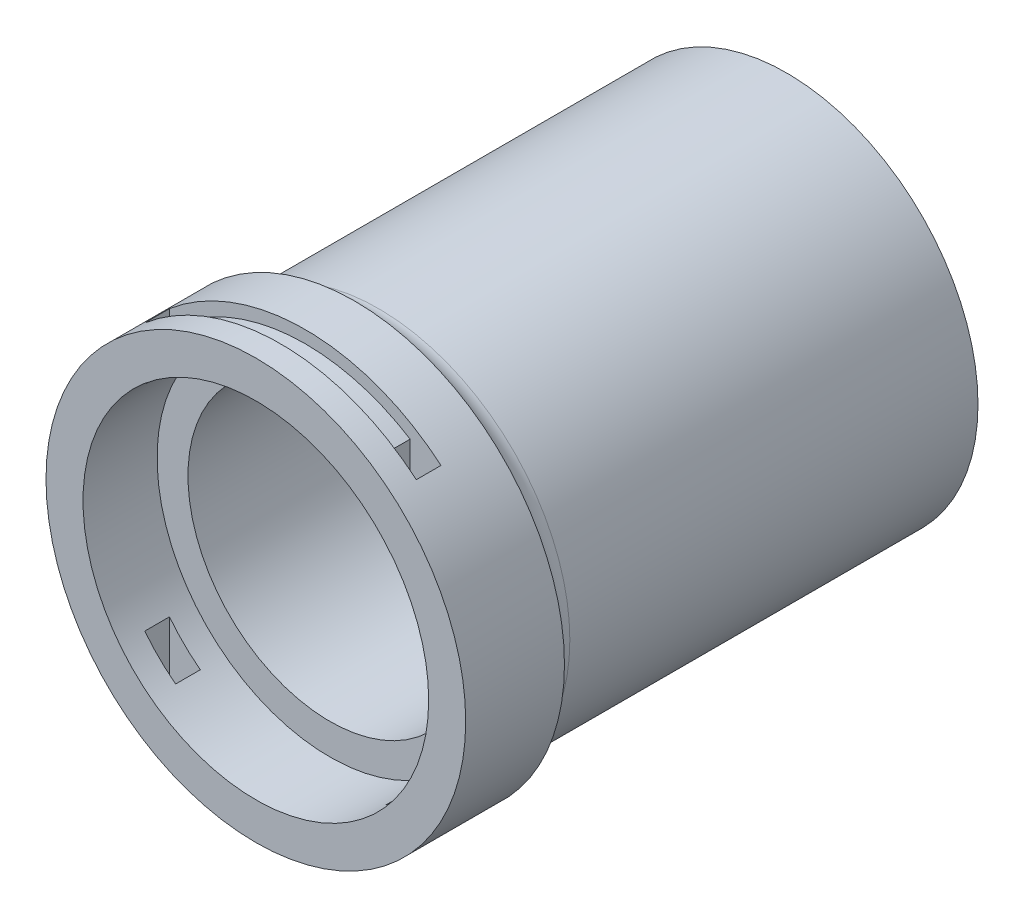
ISO-10303-21;
HEADER;
FILE_DESCRIPTION(('STEP AP214'),'2;1');
FILE_NAME('part.step','',(''),(''),'','','');
FILE_SCHEMA(('AUTOMOTIVE_DESIGN { 1 0 10303 214 1 1 1 1 }'));
ENDSEC;
DATA;
#1=APPLICATION_CONTEXT('core data for automotive mechanical design processes');
#2=APPLICATION_PROTOCOL_DEFINITION('international standard','automotive_design',2000,#1);
#3=PRODUCT_CONTEXT('',#1,'mechanical');
#4=PRODUCT('Part','Part','',(#3));
#5=PRODUCT_RELATED_PRODUCT_CATEGORY('part','',(#4));
#6=PRODUCT_DEFINITION_FORMATION('','',#4);
#7=PRODUCT_DEFINITION_CONTEXT('part definition',#1,'design');
#8=PRODUCT_DEFINITION('design','',#6,#7);
#9=PRODUCT_DEFINITION_SHAPE('','',#8);
#10=(LENGTH_UNIT() NAMED_UNIT(*) SI_UNIT(.MILLI.,.METRE.));
#11=(NAMED_UNIT(*) PLANE_ANGLE_UNIT() SI_UNIT($,.RADIAN.));
#12=(NAMED_UNIT(*) SI_UNIT($,.STERADIAN.) SOLID_ANGLE_UNIT());
#13=UNCERTAINTY_MEASURE_WITH_UNIT(LENGTH_MEASURE(1.E-05),#10,'distance_accuracy_value','');
#14=(GEOMETRIC_REPRESENTATION_CONTEXT(3) GLOBAL_UNCERTAINTY_ASSIGNED_CONTEXT((#13)) GLOBAL_UNIT_ASSIGNED_CONTEXT((#10,
#11,#12)) REPRESENTATION_CONTEXT('',''));
#15=CARTESIAN_POINT('',(0.,0.,0.));
#16=DIRECTION('',(0.,0.,1.));
#17=DIRECTION('',(1.,0.,0.));
#18=AXIS2_PLACEMENT_3D('',#15,#16,#17);
#19=CARTESIAN_POINT('',(0.,0.,-17.));
#20=DIRECTION('',(0.,0.,1.));
#21=DIRECTION('',(1.,0.,0.));
#22=AXIS2_PLACEMENT_3D('',#19,#20,#21);
#23=CYLINDRICAL_SURFACE('',#22,5.625);
#24=CARTESIAN_POINT('',(0.,0.,5.99999999999999));
#25=DIRECTION('',(0.,0.,1.));
#26=DIRECTION('',(1.,0.,0.));
#27=AXIS2_PLACEMENT_3D('',#24,#25,#26);
#28=CIRCLE('',#27,5.625);
#29=CARTESIAN_POINT('',(5.625,0.,5.99999999999999));
#30=VERTEX_POINT('',#29);
#31=EDGE_CURVE('E247',#30,#30,#28,.F.);
#32=ORIENTED_EDGE('',*,*,#31,.F.);
#33=EDGE_LOOP('',(#32));
#34=FACE_BOUND('',#33,.T.);
#35=CARTESIAN_POINT('',(0.,0.,-0.999999999999997));
#36=DIRECTION('',(0.,0.,-1.));
#37=DIRECTION('',(-1.,0.,0.));
#38=AXIS2_PLACEMENT_3D('',#35,#36,#37);
#39=CIRCLE('',#38,5.625);
#40=CARTESIAN_POINT('',(-5.625,0.,-0.999999999999997));
#41=VERTEX_POINT('',#40);
#42=EDGE_CURVE('E37',#41,#41,#39,.F.);
#43=ORIENTED_EDGE('',*,*,#42,.F.);
#44=EDGE_LOOP('',(#43));
#45=FACE_BOUND('',#44,.T.);
#46=ADVANCED_FACE('F33',(#34,#45),#23,.F.);
#47=CARTESIAN_POINT('',(-8.5,-20.,0.));
#48=DIRECTION('',(1.,0.,0.));
#49=DIRECTION('',(0.,0.,-1.));
#50=AXIS2_PLACEMENT_3D('',#47,#48,#49);
#51=PLANE('',#50);
#52=DIRECTION('',(0.,0.,1.));
#53=VECTOR('',#52,1.);
#54=CARTESIAN_POINT('',(-8.5,13.555441711726,22.));
#55=LINE('',#54,#53);
#56=CARTESIAN_POINT('',(-8.5,13.555441711726,22.));
#57=VERTEX_POINT('',#56);
#58=CARTESIAN_POINT('',(-8.5,13.555441711726,24.));
#59=VERTEX_POINT('',#58);
#60=EDGE_CURVE('E151',#57,#59,#55,.T.);
#61=ORIENTED_EDGE('',*,*,#60,.F.);
#62=DIRECTION('',(0.,1.,0.));
#63=VECTOR('',#62,1.);
#64=CARTESIAN_POINT('',(-8.5,-20.,22.));
#65=LINE('',#64,#63);
#66=CARTESIAN_POINT('',(-8.5,11.1242977306435,22.));
#67=VERTEX_POINT('',#66);
#68=EDGE_CURVE('E194',#67,#57,#65,.T.);
#69=ORIENTED_EDGE('',*,*,#68,.F.);
#70=DIRECTION('',(0.,0.,1.));
#71=VECTOR('',#70,1.);
#72=CARTESIAN_POINT('',(-8.5,11.1242977306435,20.));
#73=LINE('',#72,#71);
#74=CARTESIAN_POINT('',(-8.5,11.1242977306435,24.));
#75=VERTEX_POINT('',#74);
#76=EDGE_CURVE('E278',#75,#67,#73,.F.);
#77=ORIENTED_EDGE('',*,*,#76,.F.);
#78=DIRECTION('',(0.,1.,0.));
#79=VECTOR('',#78,1.);
#80=CARTESIAN_POINT('',(-8.5,-20.,24.));
#81=LINE('',#80,#79);
#82=EDGE_CURVE('E184',#75,#59,#81,.T.);
#83=ORIENTED_EDGE('',*,*,#82,.T.);
#84=EDGE_LOOP('',(#61,#69,#77,#83));
#85=FACE_BOUND('',#84,.T.);
#86=ADVANCED_FACE('F343',(#85),#51,.F.);
#87=CARTESIAN_POINT('',(8.5,-20.,0.));
#88=DIRECTION('',(1.,0.,0.));
#89=DIRECTION('',(0.,0.,-1.));
#90=AXIS2_PLACEMENT_3D('',#87,#88,#89);
#91=PLANE('',#90);
#92=DIRECTION('',(0.,1.,0.));
#93=VECTOR('',#92,1.);
#94=CARTESIAN_POINT('',(8.5,-20.,22.));
#95=LINE('',#94,#93);
#96=CARTESIAN_POINT('',(8.5,11.1242977306435,22.));
#97=VERTEX_POINT('',#96);
#98=CARTESIAN_POINT('',(8.5,13.555441711726,22.));
#99=VERTEX_POINT('',#98);
#100=EDGE_CURVE('E165',#97,#99,#95,.T.);
#101=ORIENTED_EDGE('',*,*,#100,.T.);
#102=DIRECTION('',(0.,0.,1.));
#103=VECTOR('',#102,1.);
#104=CARTESIAN_POINT('',(8.5,13.555441711726,22.));
#105=LINE('',#104,#103);
#106=CARTESIAN_POINT('',(8.5,13.555441711726,24.));
#107=VERTEX_POINT('',#106);
#108=EDGE_CURVE('E11',#99,#107,#105,.T.);
#109=ORIENTED_EDGE('',*,*,#108,.T.);
#110=DIRECTION('',(0.,1.,0.));
#111=VECTOR('',#110,1.);
#112=CARTESIAN_POINT('',(8.5,-20.,24.));
#113=LINE('',#112,#111);
#114=CARTESIAN_POINT('',(8.5,11.1242977306435,24.));
#115=VERTEX_POINT('',#114);
#116=EDGE_CURVE('E162',#115,#107,#113,.T.);
#117=ORIENTED_EDGE('',*,*,#116,.F.);
#118=DIRECTION('',(0.,0.,1.));
#119=VECTOR('',#118,1.);
#120=CARTESIAN_POINT('',(8.5,11.1242977306435,20.));
#121=LINE('',#120,#119);
#122=EDGE_CURVE('E293',#115,#97,#121,.F.);
#123=ORIENTED_EDGE('',*,*,#122,.T.);
#124=EDGE_LOOP('',(#101,#109,#117,#123));
#125=FACE_BOUND('',#124,.T.);
#126=ADVANCED_FACE('F161',(#125),#91,.T.);
#127=CARTESIAN_POINT('',(0.,0.,18.));
#128=DIRECTION('',(0.,0.,1.));
#129=DIRECTION('',(1.,0.,0.));
#130=AXIS2_PLACEMENT_3D('',#127,#128,#129);
#131=CYLINDRICAL_SURFACE('',#130,17.);
#132=CARTESIAN_POINT('',(0.,0.,22.));
#133=DIRECTION('',(0.,0.,1.));
#134=DIRECTION('',(1.,0.,0.));
#135=AXIS2_PLACEMENT_3D('',#132,#133,#134);
#136=CIRCLE('',#135,17.);
#137=CARTESIAN_POINT('',(-11.,12.9614813968157,22.));
#138=VERTEX_POINT('',#137);
#139=CARTESIAN_POINT('',(11.,12.9614813968157,22.));
#140=VERTEX_POINT('',#139);
#141=EDGE_CURVE('E199',#138,#140,#136,.F.);
#142=ORIENTED_EDGE('',*,*,#141,.T.);
#143=DIRECTION('',(0.,0.,1.));
#144=VECTOR('',#143,1.);
#145=CARTESIAN_POINT('',(11.,12.9614813968157,18.));
#146=LINE('',#145,#144);
#147=CARTESIAN_POINT('',(11.,12.9614813968157,24.));
#148=VERTEX_POINT('',#147);
#149=EDGE_CURVE('E178',#140,#148,#146,.T.);
#150=ORIENTED_EDGE('',*,*,#149,.T.);
#151=CARTESIAN_POINT('',(0.,0.,24.));
#152=DIRECTION('',(0.,0.,1.));
#153=DIRECTION('',(1.,0.,0.));
#154=AXIS2_PLACEMENT_3D('',#151,#152,#153);
#155=CIRCLE('',#154,17.);
#156=CARTESIAN_POINT('',(-11.,12.9614813968157,24.));
#157=VERTEX_POINT('',#156);
#158=EDGE_CURVE('E207',#157,#148,#155,.F.);
#159=ORIENTED_EDGE('',*,*,#158,.F.);
#160=DIRECTION('',(0.,0.,1.));
#161=VECTOR('',#160,1.);
#162=CARTESIAN_POINT('',(-11.,12.9614813968157,18.));
#163=LINE('',#162,#161);
#164=EDGE_CURVE('E202',#138,#157,#163,.T.);
#165=ORIENTED_EDGE('',*,*,#164,.F.);
#166=EDGE_LOOP('',(#142,#150,#159,#165));
#167=FACE_BOUND('',#166,.T.);
#168=CARTESIAN_POINT('',(0.,0.,26.));
#169=DIRECTION('',(0.,0.,1.));
#170=DIRECTION('',(1.,0.,0.));
#171=AXIS2_PLACEMENT_3D('',#168,#169,#170);
#172=CIRCLE('',#171,17.);
#173=CARTESIAN_POINT('',(17.,0.,26.));
#174=VERTEX_POINT('',#173);
#175=EDGE_CURVE('E232',#174,#174,#172,.T.);
#176=ORIENTED_EDGE('',*,*,#175,.F.);
#177=EDGE_LOOP('',(#176));
#178=FACE_BOUND('',#177,.T.);
#179=CARTESIAN_POINT('',(0.,0.,18.));
#180=DIRECTION('',(0.,0.,1.));
#181=DIRECTION('',(1.,0.,0.));
#182=AXIS2_PLACEMENT_3D('',#179,#180,#181);
#183=CIRCLE('',#182,17.);
#184=CARTESIAN_POINT('',(17.,0.,18.));
#185=VERTEX_POINT('',#184);
#186=EDGE_CURVE('E235',#185,#185,#183,.T.);
#187=ORIENTED_EDGE('',*,*,#186,.T.);
#188=EDGE_LOOP('',(#187));
#189=FACE_BOUND('',#188,.T.);
#190=DIRECTION('',(0.,0.,1.));
#191=VECTOR('',#190,1.);
#192=CARTESIAN_POINT('',(11.,-12.9614813968157,18.));
#193=LINE('',#192,#191);
#194=CARTESIAN_POINT('',(11.,-12.9614813968157,24.));
#195=VERTEX_POINT('',#194);
#196=CARTESIAN_POINT('',(11.,-12.9614813968157,22.));
#197=VERTEX_POINT('',#196);
#198=EDGE_CURVE('E181',#195,#197,#193,.F.);
#199=ORIENTED_EDGE('',*,*,#198,.T.);
#200=CARTESIAN_POINT('',(-11.,-12.9614813968157,22.));
#201=VERTEX_POINT('',#200);
#202=EDGE_CURVE('E201',#197,#201,#136,.F.);
#203=ORIENTED_EDGE('',*,*,#202,.T.);
#204=DIRECTION('',(0.,0.,1.));
#205=VECTOR('',#204,1.);
#206=CARTESIAN_POINT('',(-11.,-12.9614813968157,18.));
#207=LINE('',#206,#205);
#208=CARTESIAN_POINT('',(-11.,-12.9614813968157,24.));
#209=VERTEX_POINT('',#208);
#210=EDGE_CURVE('E204',#209,#201,#207,.F.);
#211=ORIENTED_EDGE('',*,*,#210,.F.);
#212=EDGE_CURVE('E57',#195,#209,#155,.F.);
#213=ORIENTED_EDGE('',*,*,#212,.F.);
#214=EDGE_LOOP('',(#199,#203,#211,#213));
#215=FACE_BOUND('',#214,.T.);
#216=ADVANCED_FACE('F417',(#167,#178,#189,#215),#131,.T.);
#217=DIRECTION('',(0.,0.,1.));
#218=VECTOR('',#217,1.);
#219=CARTESIAN_POINT('',(-8.5,-13.555441711726,22.));
#220=LINE('',#219,#218);
#221=CARTESIAN_POINT('',(-8.5,-13.555441711726,24.));
#222=VERTEX_POINT('',#221);
#223=CARTESIAN_POINT('',(-8.5,-13.555441711726,22.));
#224=VERTEX_POINT('',#223);
#225=EDGE_CURVE('E170',#222,#224,#220,.F.);
#226=ORIENTED_EDGE('',*,*,#225,.F.);
#227=CARTESIAN_POINT('',(-8.5,-11.1242977306435,24.));
#228=VERTEX_POINT('',#227);
#229=EDGE_CURVE('E197',#222,#228,#81,.T.);
#230=ORIENTED_EDGE('',*,*,#229,.T.);
#231=DIRECTION('',(0.,0.,1.));
#232=VECTOR('',#231,1.);
#233=CARTESIAN_POINT('',(-8.5,-11.1242977306435,20.));
#234=LINE('',#233,#232);
#235=CARTESIAN_POINT('',(-8.5,-11.1242977306435,22.));
#236=VERTEX_POINT('',#235);
#237=EDGE_CURVE('E256',#236,#228,#234,.T.);
#238=ORIENTED_EDGE('',*,*,#237,.F.);
#239=EDGE_CURVE('E193',#224,#236,#65,.T.);
#240=ORIENTED_EDGE('',*,*,#239,.F.);
#241=EDGE_LOOP('',(#226,#230,#238,#240));
#242=FACE_BOUND('',#241,.T.);
#243=ADVANCED_FACE('F351',(#242),#51,.F.);
#244=CARTESIAN_POINT('',(8.5,-13.555441711726,24.));
#245=VERTEX_POINT('',#244);
#246=CARTESIAN_POINT('',(8.5,-11.1242977306435,24.));
#247=VERTEX_POINT('',#246);
#248=EDGE_CURVE('E169',#245,#247,#113,.T.);
#249=ORIENTED_EDGE('',*,*,#248,.F.);
#250=DIRECTION('',(0.,0.,1.));
#251=VECTOR('',#250,1.);
#252=CARTESIAN_POINT('',(8.5,-13.555441711726,22.));
#253=LINE('',#252,#251);
#254=CARTESIAN_POINT('',(8.5,-13.555441711726,22.));
#255=VERTEX_POINT('',#254);
#256=EDGE_CURVE('E173',#245,#255,#253,.F.);
#257=ORIENTED_EDGE('',*,*,#256,.T.);
#258=CARTESIAN_POINT('',(8.5,-11.1242977306435,22.));
#259=VERTEX_POINT('',#258);
#260=EDGE_CURVE('E182',#255,#259,#95,.T.);
#261=ORIENTED_EDGE('',*,*,#260,.T.);
#262=DIRECTION('',(0.,0.,1.));
#263=VECTOR('',#262,1.);
#264=CARTESIAN_POINT('',(8.5,-11.1242977306435,20.));
#265=LINE('',#264,#263);
#266=EDGE_CURVE('E42',#259,#247,#265,.T.);
#267=ORIENTED_EDGE('',*,*,#266,.T.);
#268=EDGE_LOOP('',(#249,#257,#261,#267));
#269=FACE_BOUND('',#268,.T.);
#270=ADVANCED_FACE('F415',(#269),#91,.T.);
#271=CARTESIAN_POINT('',(0.,0.,20.));
#272=DIRECTION('',(0.,0.,1.));
#273=DIRECTION('',(1.,0.,0.));
#274=AXIS2_PLACEMENT_3D('',#271,#272,#273);
#275=CYLINDRICAL_SURFACE('',#274,14.);
#276=ORIENTED_EDGE('',*,*,#122,.F.);
#277=CARTESIAN_POINT('',(0.,0.,24.));
#278=DIRECTION('',(0.,0.,-1.));
#279=DIRECTION('',(-1.,0.,0.));
#280=AXIS2_PLACEMENT_3D('',#277,#278,#279);
#281=CIRCLE('',#280,14.);
#282=CARTESIAN_POINT('',(11.,8.66025403784439,24.));
#283=VERTEX_POINT('',#282);
#284=EDGE_CURVE('E168',#283,#115,#281,.F.);
#285=ORIENTED_EDGE('',*,*,#284,.F.);
#286=DIRECTION('',(0.,0.,1.));
#287=VECTOR('',#286,1.);
#288=CARTESIAN_POINT('',(11.,8.66025403784439,20.));
#289=LINE('',#288,#287);
#290=CARTESIAN_POINT('',(11.,8.66025403784439,22.));
#291=VERTEX_POINT('',#290);
#292=EDGE_CURVE('E286',#291,#283,#289,.T.);
#293=ORIENTED_EDGE('',*,*,#292,.F.);
#294=CARTESIAN_POINT('',(0.,0.,22.));
#295=DIRECTION('',(0.,0.,-1.));
#296=DIRECTION('',(-1.,0.,0.));
#297=AXIS2_PLACEMENT_3D('',#294,#295,#296);
#298=CIRCLE('',#297,14.);
#299=EDGE_CURVE('E290',#291,#97,#298,.F.);
#300=ORIENTED_EDGE('',*,*,#299,.T.);
#301=EDGE_LOOP('',(#276,#285,#293,#300));
#302=FACE_BOUND('',#301,.T.);
#303=DIRECTION('',(0.,0.,1.));
#304=VECTOR('',#303,1.);
#305=CARTESIAN_POINT('',(-11.,8.66025403784438,20.));
#306=LINE('',#305,#304);
#307=CARTESIAN_POINT('',(-11.,8.66025403784438,22.));
#308=VERTEX_POINT('',#307);
#309=CARTESIAN_POINT('',(-11.,8.66025403784438,24.));
#310=VERTEX_POINT('',#309);
#311=EDGE_CURVE('E282',#308,#310,#306,.T.);
#312=ORIENTED_EDGE('',*,*,#311,.T.);
#313=CARTESIAN_POINT('',(0.,0.,24.));
#314=DIRECTION('',(0.,0.,1.));
#315=DIRECTION('',(1.,0.,0.));
#316=AXIS2_PLACEMENT_3D('',#313,#314,#315);
#317=CIRCLE('',#316,14.);
#318=EDGE_CURVE('E279',#310,#75,#317,.F.);
#319=ORIENTED_EDGE('',*,*,#318,.T.);
#320=ORIENTED_EDGE('',*,*,#76,.T.);
#321=CARTESIAN_POINT('',(0.,0.,22.));
#322=DIRECTION('',(0.,0.,1.));
#323=DIRECTION('',(1.,0.,0.));
#324=AXIS2_PLACEMENT_3D('',#321,#322,#323);
#325=CIRCLE('',#324,14.);
#326=EDGE_CURVE('E272',#308,#67,#325,.F.);
#327=ORIENTED_EDGE('',*,*,#326,.F.);
#328=EDGE_LOOP('',(#312,#319,#320,#327));
#329=FACE_BOUND('',#328,.T.);
#330=ORIENTED_EDGE('',*,*,#237,.T.);
#331=CARTESIAN_POINT('',(-11.,-8.66025403784438,24.));
#332=VERTEX_POINT('',#331);
#333=EDGE_CURVE('E275',#228,#332,#317,.F.);
#334=ORIENTED_EDGE('',*,*,#333,.T.);
#335=DIRECTION('',(0.,0.,1.));
#336=VECTOR('',#335,1.);
#337=CARTESIAN_POINT('',(-11.,-8.66025403784438,20.));
#338=LINE('',#337,#336);
#339=CARTESIAN_POINT('',(-11.,-8.66025403784438,22.));
#340=VERTEX_POINT('',#339);
#341=EDGE_CURVE('E271',#332,#340,#338,.F.);
#342=ORIENTED_EDGE('',*,*,#341,.T.);
#343=EDGE_CURVE('E269',#236,#340,#325,.F.);
#344=ORIENTED_EDGE('',*,*,#343,.F.);
#345=EDGE_LOOP('',(#330,#334,#342,#344));
#346=FACE_BOUND('',#345,.T.);
#347=CARTESIAN_POINT('',(0.,0.,20.));
#348=DIRECTION('',(0.,0.,1.));
#349=DIRECTION('',(1.,0.,0.));
#350=AXIS2_PLACEMENT_3D('',#347,#348,#349);
#351=CIRCLE('',#350,14.);
#352=CARTESIAN_POINT('',(14.,0.,20.));
#353=VERTEX_POINT('',#352);
#354=EDGE_CURVE('E225',#353,#353,#351,.T.);
#355=ORIENTED_EDGE('',*,*,#354,.F.);
#356=EDGE_LOOP('',(#355));
#357=FACE_BOUND('',#356,.T.);
#358=CARTESIAN_POINT('',(0.,0.,26.));
#359=DIRECTION('',(0.,0.,1.));
#360=DIRECTION('',(1.,0.,0.));
#361=AXIS2_PLACEMENT_3D('',#358,#359,#360);
#362=CIRCLE('',#361,14.);
#363=CARTESIAN_POINT('',(14.,0.,26.));
#364=VERTEX_POINT('',#363);
#365=EDGE_CURVE('E229',#364,#364,#362,.T.);
#366=ORIENTED_EDGE('',*,*,#365,.T.);
#367=EDGE_LOOP('',(#366));
#368=FACE_BOUND('',#367,.T.);
#369=ORIENTED_EDGE('',*,*,#266,.F.);
#370=CARTESIAN_POINT('',(11.,-8.66025403784439,22.));
#371=VERTEX_POINT('',#370);
#372=EDGE_CURVE('E294',#259,#371,#298,.F.);
#373=ORIENTED_EDGE('',*,*,#372,.T.);
#374=DIRECTION('',(0.,0.,1.));
#375=VECTOR('',#374,1.);
#376=CARTESIAN_POINT('',(11.,-8.66025403784439,20.));
#377=LINE('',#376,#375);
#378=CARTESIAN_POINT('',(11.,-8.66025403784439,24.));
#379=VERTEX_POINT('',#378);
#380=EDGE_CURVE('E296',#379,#371,#377,.F.);
#381=ORIENTED_EDGE('',*,*,#380,.F.);
#382=EDGE_CURVE('E287',#247,#379,#281,.F.);
#383=ORIENTED_EDGE('',*,*,#382,.F.);
#384=EDGE_LOOP('',(#369,#373,#381,#383));
#385=FACE_BOUND('',#384,.T.);
#386=ADVANCED_FACE('F307',(#302,#329,#346,#357,#368,#385),#275,.F.);
#387=CARTESIAN_POINT('',(0.,0.,-17.));
#388=DIRECTION('',(0.,0.,1.));
#389=DIRECTION('',(1.,0.,0.));
#390=AXIS2_PLACEMENT_3D('',#387,#388,#389);
#391=PLANE('',#390);
#392=CARTESIAN_POINT('',(0.,0.,-17.));
#393=DIRECTION('',(0.,0.,-1.));
#394=DIRECTION('',(-1.,0.,0.));
#395=AXIS2_PLACEMENT_3D('',#392,#393,#394);
#396=CIRCLE('',#395,6.875);
#397=CARTESIAN_POINT('',(-6.875,0.,-17.));
#398=VERTEX_POINT('',#397);
#399=EDGE_CURVE('E330',#398,#398,#396,.T.);
#400=ORIENTED_EDGE('',*,*,#399,.F.);
#401=EDGE_LOOP('',(#400));
#402=FACE_BOUND('',#401,.T.);
#403=CARTESIAN_POINT('',(0.,10.,-17.));
#404=DIRECTION('',(0.,0.,1.));
#405=DIRECTION('',(1.,0.,0.));
#406=AXIS2_PLACEMENT_3D('',#403,#404,#405);
#407=CIRCLE('',#406,0.5);
#408=CARTESIAN_POINT('',(0.5,10.,-17.));
#409=VERTEX_POINT('',#408);
#410=EDGE_CURVE('E213',#409,#409,#407,.T.);
#411=ORIENTED_EDGE('',*,*,#410,.T.);
#412=EDGE_LOOP('',(#411));
#413=FACE_BOUND('',#412,.T.);
#414=CARTESIAN_POINT('',(0.,-10.,-17.));
#415=DIRECTION('',(0.,0.,1.));
#416=DIRECTION('',(1.,0.,0.));
#417=AXIS2_PLACEMENT_3D('',#414,#415,#416);
#418=CIRCLE('',#417,0.5);
#419=CARTESIAN_POINT('',(0.5,-10.,-17.));
#420=VERTEX_POINT('',#419);
#421=EDGE_CURVE('E221',#420,#420,#418,.T.);
#422=ORIENTED_EDGE('',*,*,#421,.T.);
#423=EDGE_LOOP('',(#422));
#424=FACE_BOUND('',#423,.T.);
#425=CARTESIAN_POINT('',(0.,0.,-17.));
#426=DIRECTION('',(0.,0.,1.));
#427=DIRECTION('',(1.,0.,0.));
#428=AXIS2_PLACEMENT_3D('',#425,#426,#427);
#429=CIRCLE('',#428,15.5);
#430=CARTESIAN_POINT('',(15.5,0.,-17.));
#431=VERTEX_POINT('',#430);
#432=EDGE_CURVE('E248',#431,#431,#429,.T.);
#433=ORIENTED_EDGE('',*,*,#432,.F.);
#434=EDGE_LOOP('',(#433));
#435=FACE_BOUND('',#434,.T.);
#436=CARTESIAN_POINT('',(10.,0.,-17.));
#437=DIRECTION('',(0.,0.,1.));
#438=DIRECTION('',(1.,0.,0.));
#439=AXIS2_PLACEMENT_3D('',#436,#437,#438);
#440=CIRCLE('',#439,0.500000000000001);
#441=CARTESIAN_POINT('',(10.5,0.,-17.));
#442=VERTEX_POINT('',#441);
#443=EDGE_CURVE('E217',#442,#442,#440,.T.);
#444=ORIENTED_EDGE('',*,*,#443,.T.);
#445=EDGE_LOOP('',(#444));
#446=FACE_BOUND('',#445,.T.);
#447=CARTESIAN_POINT('',(-10.,0.,-17.));
#448=DIRECTION('',(0.,0.,1.));
#449=DIRECTION('',(1.,0.,0.));
#450=AXIS2_PLACEMENT_3D('',#447,#448,#449);
#451=CIRCLE('',#450,0.500000000000001);
#452=CARTESIAN_POINT('',(-9.5,0.,-17.));
#453=VERTEX_POINT('',#452);
#454=EDGE_CURVE('E209',#453,#453,#451,.T.);
#455=ORIENTED_EDGE('',*,*,#454,.T.);
#456=EDGE_LOOP('',(#455));
#457=FACE_BOUND('',#456,.T.);
#458=ADVANCED_FACE('F362',(#402,#413,#424,#435,#446,#457),#391,.F.);
#459=CARTESIAN_POINT('',(0.,0.,-12.));
#460=DIRECTION('',(0.,0.,1.));
#461=DIRECTION('',(1.,0.,0.));
#462=AXIS2_PLACEMENT_3D('',#459,#460,#461);
#463=PLANE('',#462);
#464=CARTESIAN_POINT('',(0.,10.,-12.));
#465=DIRECTION('',(0.,0.,1.));
#466=DIRECTION('',(1.,0.,0.));
#467=AXIS2_PLACEMENT_3D('',#464,#465,#466);
#468=CIRCLE('',#467,0.5);
#469=CARTESIAN_POINT('',(0.5,10.,-12.));
#470=VERTEX_POINT('',#469);
#471=EDGE_CURVE('E216',#470,#470,#468,.F.);
#472=ORIENTED_EDGE('',*,*,#471,.T.);
#473=EDGE_LOOP('',(#472));
#474=FACE_BOUND('',#473,.T.);
#475=CARTESIAN_POINT('',(0.,-10.,-12.));
#476=DIRECTION('',(0.,0.,1.));
#477=DIRECTION('',(1.,0.,0.));
#478=AXIS2_PLACEMENT_3D('',#475,#476,#477);
#479=CIRCLE('',#478,0.5);
#480=CARTESIAN_POINT('',(0.5,-10.,-12.));
#481=VERTEX_POINT('',#480);
#482=EDGE_CURVE('E224',#481,#481,#479,.F.);
#483=ORIENTED_EDGE('',*,*,#482,.T.);
#484=EDGE_LOOP('',(#483));
#485=FACE_BOUND('',#484,.T.);
#486=CARTESIAN_POINT('',(0.,0.,-12.));
#487=DIRECTION('',(0.,0.,1.));
#488=DIRECTION('',(1.,0.,0.));
#489=AXIS2_PLACEMENT_3D('',#486,#487,#488);
#490=CIRCLE('',#489,8.5);
#491=CARTESIAN_POINT('',(8.5,0.,-12.));
#492=VERTEX_POINT('',#491);
#493=EDGE_CURVE('E239',#492,#492,#490,.T.);
#494=ORIENTED_EDGE('',*,*,#493,.F.);
#495=EDGE_LOOP('',(#494));
#496=FACE_BOUND('',#495,.T.);
#497=CARTESIAN_POINT('',(0.,0.,-12.));
#498=DIRECTION('',(0.,0.,1.));
#499=DIRECTION('',(1.,0.,0.));
#500=AXIS2_PLACEMENT_3D('',#497,#498,#499);
#501=CIRCLE('',#500,11.5);
#502=CARTESIAN_POINT('',(11.5,0.,-12.));
#503=VERTEX_POINT('',#502);
#504=EDGE_CURVE('E242',#503,#503,#501,.T.);
#505=ORIENTED_EDGE('',*,*,#504,.T.);
#506=EDGE_LOOP('',(#505));
#507=FACE_BOUND('',#506,.T.);
#508=CARTESIAN_POINT('',(10.,0.,-12.));
#509=DIRECTION('',(0.,0.,1.));
#510=DIRECTION('',(1.,0.,0.));
#511=AXIS2_PLACEMENT_3D('',#508,#509,#510);
#512=CIRCLE('',#511,0.500000000000001);
#513=CARTESIAN_POINT('',(10.5,0.,-12.));
#514=VERTEX_POINT('',#513);
#515=EDGE_CURVE('E220',#514,#514,#512,.F.);
#516=ORIENTED_EDGE('',*,*,#515,.T.);
#517=EDGE_LOOP('',(#516));
#518=FACE_BOUND('',#517,.T.);
#519=CARTESIAN_POINT('',(-10.,0.,-12.));
#520=DIRECTION('',(0.,0.,1.));
#521=DIRECTION('',(1.,0.,0.));
#522=AXIS2_PLACEMENT_3D('',#519,#520,#521);
#523=CIRCLE('',#522,0.500000000000001);
#524=CARTESIAN_POINT('',(-9.5,0.,-12.));
#525=VERTEX_POINT('',#524);
#526=EDGE_CURVE('E212',#525,#525,#523,.F.);
#527=ORIENTED_EDGE('',*,*,#526,.T.);
#528=EDGE_LOOP('',(#527));
#529=FACE_BOUND('',#528,.T.);
#530=ADVANCED_FACE('F364',(#474,#485,#496,#507,#518,#529),#463,.T.);
#531=CARTESIAN_POINT('',(0.,0.,54.));
#532=DIRECTION('',(0.,0.,-1.));
#533=DIRECTION('',(-1.,0.,0.));
#534=AXIS2_PLACEMENT_3D('',#531,#532,#533);
#535=CYLINDRICAL_SURFACE('',#534,11.5);
#536=ORIENTED_EDGE('',*,*,#504,.F.);
#537=EDGE_LOOP('',(#536));
#538=FACE_BOUND('',#537,.T.);
#539=CARTESIAN_POINT('',(0.,0.,20.));
#540=DIRECTION('',(0.,0.,1.));
#541=DIRECTION('',(1.,0.,0.));
#542=AXIS2_PLACEMENT_3D('',#539,#540,#541);
#543=CIRCLE('',#542,11.5);
#544=CARTESIAN_POINT('',(11.5,0.,20.));
#545=VERTEX_POINT('',#544);
#546=EDGE_CURVE('E228',#545,#545,#543,.T.);
#547=ORIENTED_EDGE('',*,*,#546,.T.);
#548=EDGE_LOOP('',(#547));
#549=FACE_BOUND('',#548,.T.);
#550=ADVANCED_FACE('F355',(#538,#549),#535,.F.);
#551=CARTESIAN_POINT('',(0.,0.,26.));
#552=DIRECTION('',(0.,0.,1.));
#553=DIRECTION('',(1.,0.,0.));
#554=AXIS2_PLACEMENT_3D('',#551,#552,#553);
#555=PLANE('',#554);
#556=ORIENTED_EDGE('',*,*,#365,.F.);
#557=EDGE_LOOP('',(#556));
#558=FACE_BOUND('',#557,.T.);
#559=ORIENTED_EDGE('',*,*,#175,.T.);
#560=EDGE_LOOP('',(#559));
#561=FACE_BOUND('',#560,.T.);
#562=ADVANCED_FACE('F357',(#558,#561),#555,.T.);
#563=CARTESIAN_POINT('',(0.,0.,-17.));
#564=DIRECTION('',(0.,0.,1.));
#565=DIRECTION('',(1.,0.,0.));
#566=AXIS2_PLACEMENT_3D('',#563,#564,#565);
#567=CYLINDRICAL_SURFACE('',#566,15.5);
#568=CARTESIAN_POINT('',(0.,0.,16.0635083268963));
#569=DIRECTION('',(0.,0.,1.));
#570=DIRECTION('',(1.,0.,0.));
#571=AXIS2_PLACEMENT_3D('',#568,#569,#570);
#572=CIRCLE('',#571,15.5);
#573=CARTESIAN_POINT('',(15.5,0.,16.0635083268963));
#574=VERTEX_POINT('',#573);
#575=EDGE_CURVE('E251',#574,#574,#572,.F.);
#576=ORIENTED_EDGE('',*,*,#575,.T.);
#577=EDGE_LOOP('',(#576));
#578=FACE_BOUND('',#577,.T.);
#579=ORIENTED_EDGE('',*,*,#432,.T.);
#580=EDGE_LOOP('',(#579));
#581=FACE_BOUND('',#580,.T.);
#582=ADVANCED_FACE('F360',(#578,#581),#567,.T.);
#583=CARTESIAN_POINT('',(0.,0.,5.99999999999999));
#584=DIRECTION('',(0.,0.,1.));
#585=DIRECTION('',(1.,0.,0.));
#586=AXIS2_PLACEMENT_3D('',#583,#584,#585);
#587=PLANE('',#586);
#588=ORIENTED_EDGE('',*,*,#31,.T.);
#589=EDGE_LOOP('',(#588));
#590=FACE_BOUND('',#589,.T.);
#591=CARTESIAN_POINT('',(0.,0.,5.99999999999999));
#592=DIRECTION('',(0.,0.,1.));
#593=DIRECTION('',(1.,0.,0.));
#594=AXIS2_PLACEMENT_3D('',#591,#592,#593);
#595=CIRCLE('',#594,8.5);
#596=CARTESIAN_POINT('',(8.5,0.,5.99999999999999));
#597=VERTEX_POINT('',#596);
#598=EDGE_CURVE('E238',#597,#597,#595,.T.);
#599=ORIENTED_EDGE('',*,*,#598,.T.);
#600=EDGE_LOOP('',(#599));
#601=FACE_BOUND('',#600,.T.);
#602=ADVANCED_FACE('F367',(#590,#601),#587,.T.);
#603=CARTESIAN_POINT('',(0.,0.,-12.));
#604=DIRECTION('',(0.,0.,1.));
#605=DIRECTION('',(1.,0.,0.));
#606=AXIS2_PLACEMENT_3D('',#603,#604,#605);
#607=CYLINDRICAL_SURFACE('',#606,8.5);
#608=ORIENTED_EDGE('',*,*,#493,.T.);
#609=EDGE_LOOP('',(#608));
#610=FACE_BOUND('',#609,.T.);
#611=ORIENTED_EDGE('',*,*,#598,.F.);
#612=EDGE_LOOP('',(#611));
#613=FACE_BOUND('',#612,.T.);
#614=ADVANCED_FACE('F372',(#610,#613),#607,.T.);
#615=CARTESIAN_POINT('',(0.,0.,16.0635083268963));
#616=DIRECTION('',(0.,0.,1.));
#617=DIRECTION('',(1.,0.,0.));
#618=AXIS2_PLACEMENT_3D('',#615,#616,#617);
#619=TOROIDAL_SURFACE('',#618,17.5,2.);
#620=ORIENTED_EDGE('',*,*,#186,.F.);
#621=EDGE_LOOP('',(#620));
#622=FACE_BOUND('',#621,.T.);
#623=ORIENTED_EDGE('',*,*,#575,.F.);
#624=EDGE_LOOP('',(#623));
#625=FACE_BOUND('',#624,.T.);
#626=ADVANCED_FACE('F35',(#622,#625),#619,.F.);
#627=CARTESIAN_POINT('',(0.,0.,20.));
#628=DIRECTION('',(0.,0.,1.));
#629=DIRECTION('',(1.,0.,0.));
#630=AXIS2_PLACEMENT_3D('',#627,#628,#629);
#631=PLANE('',#630);
#632=ORIENTED_EDGE('',*,*,#546,.F.);
#633=EDGE_LOOP('',(#632));
#634=FACE_BOUND('',#633,.T.);
#635=ORIENTED_EDGE('',*,*,#354,.T.);
#636=EDGE_LOOP('',(#635));
#637=FACE_BOUND('',#636,.T.);
#638=ADVANCED_FACE('F408',(#634,#637),#631,.T.);
#639=CARTESIAN_POINT('',(0.,-10.,26.));
#640=DIRECTION('',(0.,0.,-1.));
#641=DIRECTION('',(-1.,0.,0.));
#642=AXIS2_PLACEMENT_3D('',#639,#640,#641);
#643=CYLINDRICAL_SURFACE('',#642,0.5);
#644=ORIENTED_EDGE('',*,*,#482,.F.);
#645=EDGE_LOOP('',(#644));
#646=FACE_BOUND('',#645,.T.);
#647=ORIENTED_EDGE('',*,*,#421,.F.);
#648=EDGE_LOOP('',(#647));
#649=FACE_BOUND('',#648,.T.);
#650=ADVANCED_FACE('F404',(#646,#649),#643,.F.);
#651=CARTESIAN_POINT('',(10.,0.,26.));
#652=DIRECTION('',(0.,0.,-1.));
#653=DIRECTION('',(-1.,0.,0.));
#654=AXIS2_PLACEMENT_3D('',#651,#652,#653);
#655=CYLINDRICAL_SURFACE('',#654,0.500000000000001);
#656=ORIENTED_EDGE('',*,*,#515,.F.);
#657=EDGE_LOOP('',(#656));
#658=FACE_BOUND('',#657,.T.);
#659=ORIENTED_EDGE('',*,*,#443,.F.);
#660=EDGE_LOOP('',(#659));
#661=FACE_BOUND('',#660,.T.);
#662=ADVANCED_FACE('F395',(#658,#661),#655,.F.);
#663=CARTESIAN_POINT('',(0.,10.,26.));
#664=DIRECTION('',(0.,0.,-1.));
#665=DIRECTION('',(-1.,0.,0.));
#666=AXIS2_PLACEMENT_3D('',#663,#664,#665);
#667=CYLINDRICAL_SURFACE('',#666,0.5);
#668=ORIENTED_EDGE('',*,*,#471,.F.);
#669=EDGE_LOOP('',(#668));
#670=FACE_BOUND('',#669,.T.);
#671=ORIENTED_EDGE('',*,*,#410,.F.);
#672=EDGE_LOOP('',(#671));
#673=FACE_BOUND('',#672,.T.);
#674=ADVANCED_FACE('F385',(#670,#673),#667,.F.);
#675=CARTESIAN_POINT('',(-10.,0.,26.));
#676=DIRECTION('',(0.,0.,-1.));
#677=DIRECTION('',(-1.,0.,0.));
#678=AXIS2_PLACEMENT_3D('',#675,#676,#677);
#679=CYLINDRICAL_SURFACE('',#678,0.500000000000001);
#680=ORIENTED_EDGE('',*,*,#526,.F.);
#681=EDGE_LOOP('',(#680));
#682=FACE_BOUND('',#681,.T.);
#683=ORIENTED_EDGE('',*,*,#454,.F.);
#684=EDGE_LOOP('',(#683));
#685=FACE_BOUND('',#684,.T.);
#686=ADVANCED_FACE('F383',(#682,#685),#679,.F.);
#687=CARTESIAN_POINT('',(0.,-20.,22.));
#688=DIRECTION('',(0.,0.,1.));
#689=DIRECTION('',(1.,0.,0.));
#690=AXIS2_PLACEMENT_3D('',#687,#688,#689);
#691=PLANE('',#690);
#692=ORIENTED_EDGE('',*,*,#202,.F.);
#693=DIRECTION('',(0.,1.,0.));
#694=VECTOR('',#693,1.);
#695=CARTESIAN_POINT('',(11.,-20.,22.));
#696=LINE('',#695,#694);
#697=EDGE_CURVE('E314',#197,#371,#696,.T.);
#698=ORIENTED_EDGE('',*,*,#697,.T.);
#699=ORIENTED_EDGE('',*,*,#372,.F.);
#700=ORIENTED_EDGE('',*,*,#260,.F.);
#701=CARTESIAN_POINT('',(0.,0.,22.));
#702=DIRECTION('',(0.,0.,1.));
#703=DIRECTION('',(1.,0.,0.));
#704=AXIS2_PLACEMENT_3D('',#701,#702,#703);
#705=CIRCLE('',#704,16.);
#706=EDGE_CURVE('E325',#224,#255,#705,.T.);
#707=ORIENTED_EDGE('',*,*,#706,.F.);
#708=ORIENTED_EDGE('',*,*,#239,.T.);
#709=ORIENTED_EDGE('',*,*,#343,.T.);
#710=DIRECTION('',(0.,1.,0.));
#711=VECTOR('',#710,1.);
#712=CARTESIAN_POINT('',(-11.,-20.,22.));
#713=LINE('',#712,#711);
#714=EDGE_CURVE('E189',#201,#340,#713,.T.);
#715=ORIENTED_EDGE('',*,*,#714,.F.);
#716=EDGE_LOOP('',(#692,#698,#699,#700,#707,#708,#709,#715));
#717=FACE_BOUND('',#716,.T.);
#718=ADVANCED_FACE('F311',(#717),#691,.T.);
#719=CARTESIAN_POINT('',(-11.,-20.,0.));
#720=DIRECTION('',(-1.,0.,0.));
#721=DIRECTION('',(0.,0.,1.));
#722=AXIS2_PLACEMENT_3D('',#719,#720,#721);
#723=PLANE('',#722);
#724=ORIENTED_EDGE('',*,*,#210,.T.);
#725=ORIENTED_EDGE('',*,*,#714,.T.);
#726=ORIENTED_EDGE('',*,*,#341,.F.);
#727=DIRECTION('',(0.,1.,0.));
#728=VECTOR('',#727,1.);
#729=CARTESIAN_POINT('',(-11.,-20.,24.));
#730=LINE('',#729,#728);
#731=EDGE_CURVE('E188',#209,#332,#730,.T.);
#732=ORIENTED_EDGE('',*,*,#731,.F.);
#733=EDGE_LOOP('',(#724,#725,#726,#732));
#734=FACE_BOUND('',#733,.T.);
#735=ADVANCED_FACE('F392',(#734),#723,.F.);
#736=CARTESIAN_POINT('',(0.,-20.,24.));
#737=DIRECTION('',(0.,0.,1.));
#738=DIRECTION('',(1.,0.,0.));
#739=AXIS2_PLACEMENT_3D('',#736,#737,#738);
#740=PLANE('',#739);
#741=ORIENTED_EDGE('',*,*,#229,.F.);
#742=CARTESIAN_POINT('',(0.,0.,24.));
#743=DIRECTION('',(0.,0.,1.));
#744=DIRECTION('',(1.,0.,0.));
#745=AXIS2_PLACEMENT_3D('',#742,#743,#744);
#746=CIRCLE('',#745,16.);
#747=EDGE_CURVE('E49',#222,#245,#746,.T.);
#748=ORIENTED_EDGE('',*,*,#747,.T.);
#749=ORIENTED_EDGE('',*,*,#248,.T.);
#750=ORIENTED_EDGE('',*,*,#382,.T.);
#751=DIRECTION('',(0.,1.,0.));
#752=VECTOR('',#751,1.);
#753=CARTESIAN_POINT('',(11.,-20.,24.));
#754=LINE('',#753,#752);
#755=EDGE_CURVE('E321',#195,#379,#754,.T.);
#756=ORIENTED_EDGE('',*,*,#755,.F.);
#757=ORIENTED_EDGE('',*,*,#212,.T.);
#758=ORIENTED_EDGE('',*,*,#731,.T.);
#759=ORIENTED_EDGE('',*,*,#333,.F.);
#760=EDGE_LOOP('',(#741,#748,#749,#750,#756,#757,#758,#759));
#761=FACE_BOUND('',#760,.T.);
#762=ADVANCED_FACE('F400',(#761),#740,.F.);
#763=ORIENTED_EDGE('',*,*,#158,.T.);
#764=EDGE_CURVE('E172',#283,#148,#754,.T.);
#765=ORIENTED_EDGE('',*,*,#764,.F.);
#766=ORIENTED_EDGE('',*,*,#284,.T.);
#767=ORIENTED_EDGE('',*,*,#116,.T.);
#768=CARTESIAN_POINT('',(0.,0.,24.));
#769=DIRECTION('',(0.,0.,1.));
#770=DIRECTION('',(-1.,0.,0.));
#771=AXIS2_PLACEMENT_3D('',#768,#769,#770);
#772=CIRCLE('',#771,16.);
#773=EDGE_CURVE('E147',#107,#59,#772,.T.);
#774=ORIENTED_EDGE('',*,*,#773,.T.);
#775=ORIENTED_EDGE('',*,*,#82,.F.);
#776=ORIENTED_EDGE('',*,*,#318,.F.);
#777=EDGE_CURVE('E185',#310,#157,#730,.T.);
#778=ORIENTED_EDGE('',*,*,#777,.T.);
#779=EDGE_LOOP('',(#763,#765,#766,#767,#774,#775,#776,#778));
#780=FACE_BOUND('',#779,.T.);
#781=ADVANCED_FACE('F166',(#780),#740,.F.);
#782=ORIENTED_EDGE('',*,*,#164,.T.);
#783=ORIENTED_EDGE('',*,*,#777,.F.);
#784=ORIENTED_EDGE('',*,*,#311,.F.);
#785=EDGE_CURVE('E190',#308,#138,#713,.T.);
#786=ORIENTED_EDGE('',*,*,#785,.T.);
#787=EDGE_LOOP('',(#782,#783,#784,#786));
#788=FACE_BOUND('',#787,.T.);
#789=ADVANCED_FACE('F468',(#788),#723,.F.);
#790=ORIENTED_EDGE('',*,*,#68,.T.);
#791=CARTESIAN_POINT('',(0.,0.,22.));
#792=DIRECTION('',(0.,0.,1.));
#793=DIRECTION('',(-1.,0.,0.));
#794=AXIS2_PLACEMENT_3D('',#791,#792,#793);
#795=CIRCLE('',#794,16.);
#796=EDGE_CURVE('E156',#99,#57,#795,.T.);
#797=ORIENTED_EDGE('',*,*,#796,.F.);
#798=ORIENTED_EDGE('',*,*,#100,.F.);
#799=ORIENTED_EDGE('',*,*,#299,.F.);
#800=EDGE_CURVE('E318',#291,#140,#696,.T.);
#801=ORIENTED_EDGE('',*,*,#800,.T.);
#802=ORIENTED_EDGE('',*,*,#141,.F.);
#803=ORIENTED_EDGE('',*,*,#785,.F.);
#804=ORIENTED_EDGE('',*,*,#326,.T.);
#805=EDGE_LOOP('',(#790,#797,#798,#799,#801,#802,#803,#804));
#806=FACE_BOUND('',#805,.T.);
#807=ADVANCED_FACE('F394',(#806),#691,.T.);
#808=CARTESIAN_POINT('',(11.,-20.,0.));
#809=DIRECTION('',(-1.,0.,0.));
#810=DIRECTION('',(0.,0.,1.));
#811=AXIS2_PLACEMENT_3D('',#808,#809,#810);
#812=PLANE('',#811);
#813=ORIENTED_EDGE('',*,*,#800,.F.);
#814=ORIENTED_EDGE('',*,*,#292,.T.);
#815=ORIENTED_EDGE('',*,*,#764,.T.);
#816=ORIENTED_EDGE('',*,*,#149,.F.);
#817=EDGE_LOOP('',(#813,#814,#815,#816));
#818=FACE_BOUND('',#817,.T.);
#819=ADVANCED_FACE('F459',(#818),#812,.T.);
#820=ORIENTED_EDGE('',*,*,#755,.T.);
#821=ORIENTED_EDGE('',*,*,#380,.T.);
#822=ORIENTED_EDGE('',*,*,#697,.F.);
#823=ORIENTED_EDGE('',*,*,#198,.F.);
#824=EDGE_LOOP('',(#820,#821,#822,#823));
#825=FACE_BOUND('',#824,.T.);
#826=ADVANCED_FACE('F454',(#825),#812,.T.);
#827=CARTESIAN_POINT('',(0.,0.,22.));
#828=DIRECTION('',(0.,0.,1.));
#829=DIRECTION('',(1.,0.,0.));
#830=AXIS2_PLACEMENT_3D('',#827,#828,#829);
#831=CYLINDRICAL_SURFACE('',#830,16.);
#832=ORIENTED_EDGE('',*,*,#225,.T.);
#833=ORIENTED_EDGE('',*,*,#706,.T.);
#834=ORIENTED_EDGE('',*,*,#256,.F.);
#835=ORIENTED_EDGE('',*,*,#747,.F.);
#836=EDGE_LOOP('',(#832,#833,#834,#835));
#837=FACE_BOUND('',#836,.T.);
#838=ADVANCED_FACE('F484',(#837),#831,.T.);
#839=CARTESIAN_POINT('',(0.,0.,22.));
#840=DIRECTION('',(0.,0.,1.));
#841=DIRECTION('',(1.,0.,0.));
#842=AXIS2_PLACEMENT_3D('',#839,#840,#841);
#843=CYLINDRICAL_SURFACE('',#842,16.);
#844=ORIENTED_EDGE('',*,*,#60,.T.);
#845=ORIENTED_EDGE('',*,*,#773,.F.);
#846=ORIENTED_EDGE('',*,*,#108,.F.);
#847=ORIENTED_EDGE('',*,*,#796,.T.);
#848=EDGE_LOOP('',(#844,#845,#846,#847));
#849=FACE_BOUND('',#848,.T.);
#850=ADVANCED_FACE('F148',(#849),#843,.T.);
#851=CARTESIAN_POINT('',(0.,0.,-0.999999999999997));
#852=DIRECTION('',(0.,0.,-1.));
#853=DIRECTION('',(-1.,0.,0.));
#854=AXIS2_PLACEMENT_3D('',#851,#852,#853);
#855=PLANE('',#854);
#856=CARTESIAN_POINT('',(0.,0.,-0.999999999999997));
#857=DIRECTION('',(0.,0.,-1.));
#858=DIRECTION('',(-1.,0.,0.));
#859=AXIS2_PLACEMENT_3D('',#856,#857,#858);
#860=CIRCLE('',#859,6.875);
#861=CARTESIAN_POINT('',(-6.875,0.,-0.999999999999997));
#862=VERTEX_POINT('',#861);
#863=EDGE_CURVE('E333',#862,#862,#860,.T.);
#864=ORIENTED_EDGE('',*,*,#863,.T.);
#865=EDGE_LOOP('',(#864));
#866=FACE_BOUND('',#865,.T.);
#867=ORIENTED_EDGE('',*,*,#42,.T.);
#868=EDGE_LOOP('',(#867));
#869=FACE_BOUND('',#868,.T.);
#870=ADVANCED_FACE('F340',(#866,#869),#855,.T.);
#871=CARTESIAN_POINT('',(0.,0.,-0.999999999999997));
#872=DIRECTION('',(0.,0.,-1.));
#873=DIRECTION('',(-1.,0.,0.));
#874=AXIS2_PLACEMENT_3D('',#871,#872,#873);
#875=CYLINDRICAL_SURFACE('',#874,6.875);
#876=ORIENTED_EDGE('',*,*,#863,.F.);
#877=EDGE_LOOP('',(#876));
#878=FACE_BOUND('',#877,.T.);
#879=ORIENTED_EDGE('',*,*,#399,.T.);
#880=EDGE_LOOP('',(#879));
#881=FACE_BOUND('',#880,.T.);
#882=ADVANCED_FACE('F582',(#878,#881),#875,.F.);
#883=CLOSED_SHELL('',(#46,#86,#126,#216,#243,#270,#386,#458,#530,#550,#562,#582,#602,#614,#626,
#638,#650,#662,#674,#686,#718,#735,#762,#781,#789,#807,#819,#826,#838,#850,#870,#882));
#884=MANIFOLD_SOLID_BREP('B2',#883);
#885=ADVANCED_BREP_SHAPE_REPRESENTATION('',(#18,#884),#14);
#886=SHAPE_DEFINITION_REPRESENTATION(#9,#885);
ENDSEC;
END-ISO-10303-21;
